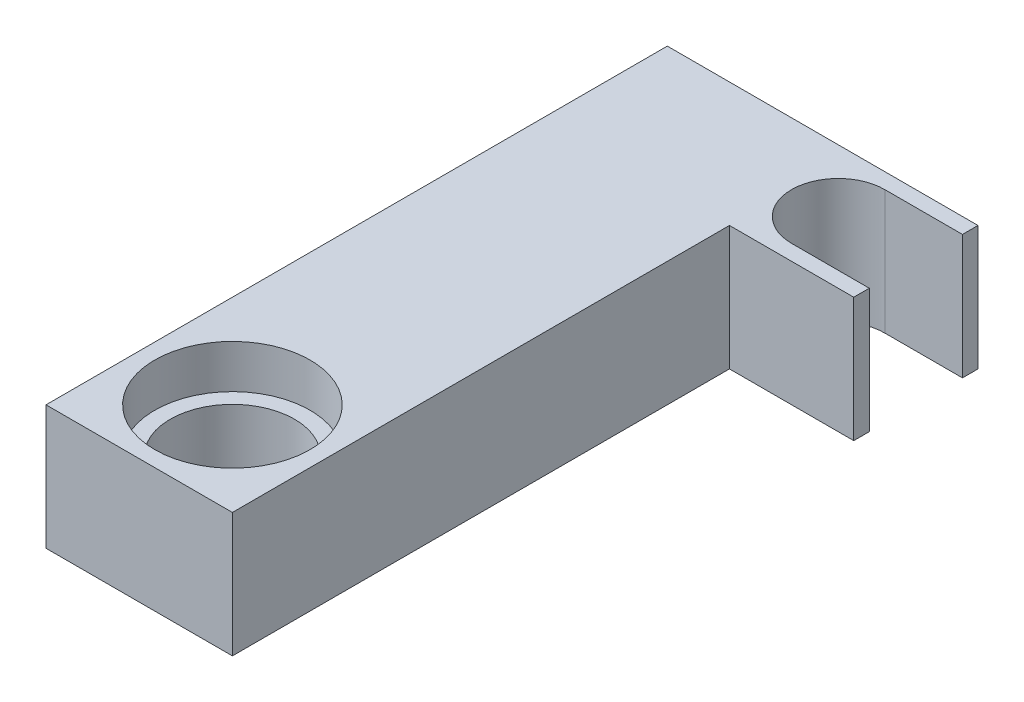
ISO-10303-21;
HEADER;
FILE_DESCRIPTION(('STEP AP214'),'2;1');
FILE_NAME('part.step','',(''),(''),'','','');
FILE_SCHEMA(('AUTOMOTIVE_DESIGN { 1 0 10303 214 1 1 1 1 }'));
ENDSEC;
DATA;
#1=APPLICATION_CONTEXT('core data for automotive mechanical design processes');
#2=APPLICATION_PROTOCOL_DEFINITION('international standard','automotive_design',2000,#1);
#3=PRODUCT_CONTEXT('',#1,'mechanical');
#4=PRODUCT('Part','Part','',(#3));
#5=PRODUCT_RELATED_PRODUCT_CATEGORY('part','',(#4));
#6=PRODUCT_DEFINITION_FORMATION('','',#4);
#7=PRODUCT_DEFINITION_CONTEXT('part definition',#1,'design');
#8=PRODUCT_DEFINITION('design','',#6,#7);
#9=PRODUCT_DEFINITION_SHAPE('','',#8);
#10=(LENGTH_UNIT() NAMED_UNIT(*) SI_UNIT(.MILLI.,.METRE.));
#11=(NAMED_UNIT(*) PLANE_ANGLE_UNIT() SI_UNIT($,.RADIAN.));
#12=(NAMED_UNIT(*) SI_UNIT($,.STERADIAN.) SOLID_ANGLE_UNIT());
#13=UNCERTAINTY_MEASURE_WITH_UNIT(LENGTH_MEASURE(1.E-05),#10,'distance_accuracy_value','');
#14=(GEOMETRIC_REPRESENTATION_CONTEXT(3) GLOBAL_UNCERTAINTY_ASSIGNED_CONTEXT((#13)) GLOBAL_UNIT_ASSIGNED_CONTEXT((#10,
#11,#12)) REPRESENTATION_CONTEXT('',''));
#15=CARTESIAN_POINT('',(0.,0.,0.));
#16=DIRECTION('',(0.,0.,1.));
#17=DIRECTION('',(1.,0.,0.));
#18=AXIS2_PLACEMENT_3D('',#15,#16,#17);
#19=CARTESIAN_POINT('',(37.5,20.,-90.));
#20=DIRECTION('',(0.,-1.,0.));
#21=DIRECTION('',(0.,0.,-1.));
#22=AXIS2_PLACEMENT_3D('',#19,#20,#21);
#23=CYLINDRICAL_SURFACE('',#22,7.50000000000001);
#24=CARTESIAN_POINT('',(37.5,0.,-90.));
#25=DIRECTION('',(0.,1.,0.));
#26=DIRECTION('',(0.,0.,1.));
#27=AXIS2_PLACEMENT_3D('',#24,#25,#26);
#28=CIRCLE('',#27,7.50000000000001);
#29=CARTESIAN_POINT('',(37.5,0.,-97.5));
#30=VERTEX_POINT('',#29);
#31=CARTESIAN_POINT('',(37.5,0.,-82.5));
#32=VERTEX_POINT('',#31);
#33=EDGE_CURVE('E144',#30,#32,#28,.T.);
#34=ORIENTED_EDGE('',*,*,#33,.F.);
#35=DIRECTION('',(0.,-1.,0.));
#36=VECTOR('',#35,1.);
#37=CARTESIAN_POINT('',(37.5,20.,-97.5));
#38=LINE('',#37,#36);
#39=CARTESIAN_POINT('',(37.5,20.,-97.5));
#40=VERTEX_POINT('',#39);
#41=EDGE_CURVE('E44',#40,#30,#38,.T.);
#42=ORIENTED_EDGE('',*,*,#41,.F.);
#43=CARTESIAN_POINT('',(37.5,20.,-90.));
#44=DIRECTION('',(0.,1.,0.));
#45=DIRECTION('',(0.,0.,1.));
#46=AXIS2_PLACEMENT_3D('',#43,#44,#45);
#47=CIRCLE('',#46,7.50000000000001);
#48=CARTESIAN_POINT('',(37.5,20.,-82.5));
#49=VERTEX_POINT('',#48);
#50=EDGE_CURVE('E249',#40,#49,#47,.T.);
#51=ORIENTED_EDGE('',*,*,#50,.T.);
#52=DIRECTION('',(0.,-1.,0.));
#53=VECTOR('',#52,1.);
#54=CARTESIAN_POINT('',(37.5,20.,-82.5));
#55=LINE('',#54,#53);
#56=EDGE_CURVE('E52',#49,#32,#55,.T.);
#57=ORIENTED_EDGE('',*,*,#56,.T.);
#58=EDGE_LOOP('',(#34,#42,#51,#57));
#59=FACE_BOUND('',#58,.T.);
#60=ADVANCED_FACE('F35',(#59),#23,.F.);
#61=CARTESIAN_POINT('',(0.,20.,-97.5));
#62=DIRECTION('',(0.,0.,-1.));
#63=DIRECTION('',(-1.,0.,0.));
#64=AXIS2_PLACEMENT_3D('',#61,#62,#63);
#65=PLANE('',#64);
#66=DIRECTION('',(1.,0.,0.));
#67=VECTOR('',#66,1.);
#68=CARTESIAN_POINT('',(0.,0.,-97.5));
#69=LINE('',#68,#67);
#70=CARTESIAN_POINT('',(50.,0.,-97.5));
#71=VERTEX_POINT('',#70);
#72=EDGE_CURVE('E146',#30,#71,#69,.T.);
#73=ORIENTED_EDGE('',*,*,#72,.T.);
#74=DIRECTION('',(0.,-1.,0.));
#75=VECTOR('',#74,1.);
#76=CARTESIAN_POINT('',(50.,20.,-97.5));
#77=LINE('',#76,#75);
#78=CARTESIAN_POINT('',(50.,20.,-97.5));
#79=VERTEX_POINT('',#78);
#80=EDGE_CURVE('E183',#79,#71,#77,.T.);
#81=ORIENTED_EDGE('',*,*,#80,.F.);
#82=DIRECTION('',(1.,0.,0.));
#83=VECTOR('',#82,1.);
#84=CARTESIAN_POINT('',(0.,20.,-97.5));
#85=LINE('',#84,#83);
#86=EDGE_CURVE('E188',#40,#79,#85,.T.);
#87=ORIENTED_EDGE('',*,*,#86,.F.);
#88=ORIENTED_EDGE('',*,*,#41,.T.);
#89=EDGE_LOOP('',(#73,#81,#87,#88));
#90=FACE_BOUND('',#89,.T.);
#91=ADVANCED_FACE('F186',(#90),#65,.F.);
#92=CARTESIAN_POINT('',(50.,20.,0.));
#93=DIRECTION('',(1.,0.,0.));
#94=DIRECTION('',(0.,0.,-1.));
#95=AXIS2_PLACEMENT_3D('',#92,#93,#94);
#96=PLANE('',#95);
#97=DIRECTION('',(0.,0.,1.));
#98=VECTOR('',#97,1.);
#99=CARTESIAN_POINT('',(50.,0.,0.));
#100=LINE('',#99,#98);
#101=CARTESIAN_POINT('',(50.,0.,-100.));
#102=VERTEX_POINT('',#101);
#103=EDGE_CURVE('E150',#102,#71,#100,.T.);
#104=ORIENTED_EDGE('',*,*,#103,.F.);
#105=DIRECTION('',(0.,-1.,0.));
#106=VECTOR('',#105,1.);
#107=CARTESIAN_POINT('',(50.,20.,-100.));
#108=LINE('',#107,#106);
#109=CARTESIAN_POINT('',(50.,20.,-100.));
#110=VERTEX_POINT('',#109);
#111=EDGE_CURVE('E181',#110,#102,#108,.T.);
#112=ORIENTED_EDGE('',*,*,#111,.F.);
#113=DIRECTION('',(0.,0.,1.));
#114=VECTOR('',#113,1.);
#115=CARTESIAN_POINT('',(50.,20.,0.));
#116=LINE('',#115,#114);
#117=EDGE_CURVE('E257',#110,#79,#116,.T.);
#118=ORIENTED_EDGE('',*,*,#117,.T.);
#119=ORIENTED_EDGE('',*,*,#80,.T.);
#120=EDGE_LOOP('',(#104,#112,#118,#119));
#121=FACE_BOUND('',#120,.T.);
#122=ADVANCED_FACE('F197',(#121),#96,.T.);
#123=CARTESIAN_POINT('',(0.,20.,-100.));
#124=DIRECTION('',(0.,0.,-1.));
#125=DIRECTION('',(-1.,0.,0.));
#126=AXIS2_PLACEMENT_3D('',#123,#124,#125);
#127=PLANE('',#126);
#128=DIRECTION('',(1.,0.,0.));
#129=VECTOR('',#128,1.);
#130=CARTESIAN_POINT('',(0.,0.,-100.));
#131=LINE('',#130,#129);
#132=CARTESIAN_POINT('',(0.,0.,-100.));
#133=VERTEX_POINT('',#132);
#134=EDGE_CURVE('E153',#133,#102,#131,.T.);
#135=ORIENTED_EDGE('',*,*,#134,.F.);
#136=DIRECTION('',(0.,-1.,0.));
#137=VECTOR('',#136,1.);
#138=CARTESIAN_POINT('',(0.,20.,-100.));
#139=LINE('',#138,#137);
#140=CARTESIAN_POINT('',(0.,20.,-100.));
#141=VERTEX_POINT('',#140);
#142=EDGE_CURVE('E179',#141,#133,#139,.T.);
#143=ORIENTED_EDGE('',*,*,#142,.F.);
#144=DIRECTION('',(1.,0.,0.));
#145=VECTOR('',#144,1.);
#146=CARTESIAN_POINT('',(0.,20.,-100.));
#147=LINE('',#146,#145);
#148=EDGE_CURVE('E260',#141,#110,#147,.T.);
#149=ORIENTED_EDGE('',*,*,#148,.T.);
#150=ORIENTED_EDGE('',*,*,#111,.T.);
#151=EDGE_LOOP('',(#135,#143,#149,#150));
#152=FACE_BOUND('',#151,.T.);
#153=ADVANCED_FACE('F202',(#152),#127,.T.);
#154=CARTESIAN_POINT('',(0.,20.,0.));
#155=DIRECTION('',(-1.,0.,0.));
#156=DIRECTION('',(0.,0.,1.));
#157=AXIS2_PLACEMENT_3D('',#154,#155,#156);
#158=PLANE('',#157);
#159=DIRECTION('',(0.,0.,-1.));
#160=VECTOR('',#159,1.);
#161=CARTESIAN_POINT('',(0.,0.,0.));
#162=LINE('',#161,#160);
#163=CARTESIAN_POINT('',(0.,0.,0.));
#164=VERTEX_POINT('',#163);
#165=EDGE_CURVE('E156',#164,#133,#162,.T.);
#166=ORIENTED_EDGE('',*,*,#165,.F.);
#167=DIRECTION('',(0.,-1.,0.));
#168=VECTOR('',#167,1.);
#169=CARTESIAN_POINT('',(0.,20.,0.));
#170=LINE('',#169,#168);
#171=CARTESIAN_POINT('',(0.,20.,0.));
#172=VERTEX_POINT('',#171);
#173=EDGE_CURVE('E177',#172,#164,#170,.T.);
#174=ORIENTED_EDGE('',*,*,#173,.F.);
#175=DIRECTION('',(0.,0.,-1.));
#176=VECTOR('',#175,1.);
#177=CARTESIAN_POINT('',(0.,20.,0.));
#178=LINE('',#177,#176);
#179=EDGE_CURVE('E263',#172,#141,#178,.T.);
#180=ORIENTED_EDGE('',*,*,#179,.T.);
#181=ORIENTED_EDGE('',*,*,#142,.T.);
#182=EDGE_LOOP('',(#166,#174,#180,#181));
#183=FACE_BOUND('',#182,.T.);
#184=ADVANCED_FACE('F206',(#183),#158,.T.);
#185=CARTESIAN_POINT('',(0.,20.,0.));
#186=DIRECTION('',(0.,0.,-1.));
#187=DIRECTION('',(-1.,0.,0.));
#188=AXIS2_PLACEMENT_3D('',#185,#186,#187);
#189=PLANE('',#188);
#190=DIRECTION('',(1.,0.,0.));
#191=VECTOR('',#190,1.);
#192=CARTESIAN_POINT('',(0.,0.,0.));
#193=LINE('',#192,#191);
#194=CARTESIAN_POINT('',(30.,0.,0.));
#195=VERTEX_POINT('',#194);
#196=EDGE_CURVE('E159',#164,#195,#193,.T.);
#197=ORIENTED_EDGE('',*,*,#196,.T.);
#198=DIRECTION('',(0.,-1.,0.));
#199=VECTOR('',#198,1.);
#200=CARTESIAN_POINT('',(30.,20.,0.));
#201=LINE('',#200,#199);
#202=CARTESIAN_POINT('',(30.,20.,0.));
#203=VERTEX_POINT('',#202);
#204=EDGE_CURVE('E175',#203,#195,#201,.T.);
#205=ORIENTED_EDGE('',*,*,#204,.F.);
#206=DIRECTION('',(1.,0.,0.));
#207=VECTOR('',#206,1.);
#208=CARTESIAN_POINT('',(0.,20.,0.));
#209=LINE('',#208,#207);
#210=EDGE_CURVE('E139',#172,#203,#209,.T.);
#211=ORIENTED_EDGE('',*,*,#210,.F.);
#212=ORIENTED_EDGE('',*,*,#173,.T.);
#213=EDGE_LOOP('',(#197,#205,#211,#212));
#214=FACE_BOUND('',#213,.T.);
#215=ADVANCED_FACE('F210',(#214),#189,.F.);
#216=CARTESIAN_POINT('',(30.,20.,0.));
#217=DIRECTION('',(1.,0.,0.));
#218=DIRECTION('',(0.,0.,-1.));
#219=AXIS2_PLACEMENT_3D('',#216,#217,#218);
#220=PLANE('',#219);
#221=DIRECTION('',(0.,0.,1.));
#222=VECTOR('',#221,1.);
#223=CARTESIAN_POINT('',(30.,0.,0.));
#224=LINE('',#223,#222);
#225=CARTESIAN_POINT('',(30.,0.,-80.));
#226=VERTEX_POINT('',#225);
#227=EDGE_CURVE('E162',#226,#195,#224,.T.);
#228=ORIENTED_EDGE('',*,*,#227,.F.);
#229=DIRECTION('',(0.,-1.,0.));
#230=VECTOR('',#229,1.);
#231=CARTESIAN_POINT('',(30.,20.,-80.));
#232=LINE('',#231,#230);
#233=CARTESIAN_POINT('',(30.,20.,-80.));
#234=VERTEX_POINT('',#233);
#235=EDGE_CURVE('E125',#234,#226,#232,.T.);
#236=ORIENTED_EDGE('',*,*,#235,.F.);
#237=DIRECTION('',(0.,0.,1.));
#238=VECTOR('',#237,1.);
#239=CARTESIAN_POINT('',(30.,20.,0.));
#240=LINE('',#239,#238);
#241=EDGE_CURVE('E137',#234,#203,#240,.T.);
#242=ORIENTED_EDGE('',*,*,#241,.T.);
#243=ORIENTED_EDGE('',*,*,#204,.T.);
#244=EDGE_LOOP('',(#228,#236,#242,#243));
#245=FACE_BOUND('',#244,.T.);
#246=ADVANCED_FACE('F214',(#245),#220,.T.);
#247=CARTESIAN_POINT('',(0.,20.,-80.));
#248=DIRECTION('',(0.,0.,1.));
#249=DIRECTION('',(1.,0.,0.));
#250=AXIS2_PLACEMENT_3D('',#247,#248,#249);
#251=PLANE('',#250);
#252=DIRECTION('',(-1.,0.,0.));
#253=VECTOR('',#252,1.);
#254=CARTESIAN_POINT('',(0.,0.,-80.));
#255=LINE('',#254,#253);
#256=CARTESIAN_POINT('',(50.,0.,-80.));
#257=VERTEX_POINT('',#256);
#258=EDGE_CURVE('E122',#257,#226,#255,.T.);
#259=ORIENTED_EDGE('',*,*,#258,.F.);
#260=DIRECTION('',(0.,-1.,0.));
#261=VECTOR('',#260,1.);
#262=CARTESIAN_POINT('',(50.,20.,-80.));
#263=LINE('',#262,#261);
#264=CARTESIAN_POINT('',(50.,20.,-80.));
#265=VERTEX_POINT('',#264);
#266=EDGE_CURVE('E116',#265,#257,#263,.T.);
#267=ORIENTED_EDGE('',*,*,#266,.F.);
#268=DIRECTION('',(-1.,0.,0.));
#269=VECTOR('',#268,1.);
#270=CARTESIAN_POINT('',(0.,20.,-80.));
#271=LINE('',#270,#269);
#272=EDGE_CURVE('E120',#265,#234,#271,.T.);
#273=ORIENTED_EDGE('',*,*,#272,.T.);
#274=ORIENTED_EDGE('',*,*,#235,.T.);
#275=EDGE_LOOP('',(#259,#267,#273,#274));
#276=FACE_BOUND('',#275,.T.);
#277=ADVANCED_FACE('F118',(#276),#251,.T.);
#278=CARTESIAN_POINT('',(50.,20.,0.));
#279=DIRECTION('',(-1.,0.,0.));
#280=DIRECTION('',(0.,0.,1.));
#281=AXIS2_PLACEMENT_3D('',#278,#279,#280);
#282=PLANE('',#281);
#283=DIRECTION('',(0.,0.,-1.));
#284=VECTOR('',#283,1.);
#285=CARTESIAN_POINT('',(50.,0.,0.));
#286=LINE('',#285,#284);
#287=CARTESIAN_POINT('',(50.,0.,-82.5));
#288=VERTEX_POINT('',#287);
#289=EDGE_CURVE('E166',#257,#288,#286,.T.);
#290=ORIENTED_EDGE('',*,*,#289,.T.);
#291=DIRECTION('',(0.,-1.,0.));
#292=VECTOR('',#291,1.);
#293=CARTESIAN_POINT('',(50.,20.,-82.5));
#294=LINE('',#293,#292);
#295=CARTESIAN_POINT('',(50.,20.,-82.5));
#296=VERTEX_POINT('',#295);
#297=EDGE_CURVE('E85',#296,#288,#294,.T.);
#298=ORIENTED_EDGE('',*,*,#297,.F.);
#299=DIRECTION('',(0.,0.,-1.));
#300=VECTOR('',#299,1.);
#301=CARTESIAN_POINT('',(50.,20.,0.));
#302=LINE('',#301,#300);
#303=EDGE_CURVE('E127',#265,#296,#302,.T.);
#304=ORIENTED_EDGE('',*,*,#303,.F.);
#305=ORIENTED_EDGE('',*,*,#266,.T.);
#306=EDGE_LOOP('',(#290,#298,#304,#305));
#307=FACE_BOUND('',#306,.T.);
#308=ADVANCED_FACE('F128',(#307),#282,.F.);
#309=CARTESIAN_POINT('',(15.,20.,-15.));
#310=DIRECTION('',(0.,-1.,0.));
#311=DIRECTION('',(0.,0.,-1.));
#312=AXIS2_PLACEMENT_3D('',#309,#310,#311);
#313=CYLINDRICAL_SURFACE('',#312,12.5);
#314=CARTESIAN_POINT('',(15.,13.,-15.));
#315=DIRECTION('',(0.,1.,0.));
#316=DIRECTION('',(0.,0.,1.));
#317=AXIS2_PLACEMENT_3D('',#314,#315,#316);
#318=CIRCLE('',#317,12.5);
#319=CARTESIAN_POINT('',(15.,13.,-2.50000000000001));
#320=VERTEX_POINT('',#319);
#321=EDGE_CURVE('E11',#320,#320,#318,.T.);
#322=ORIENTED_EDGE('',*,*,#321,.F.);
#323=EDGE_LOOP('',(#322));
#324=FACE_BOUND('',#323,.T.);
#325=CARTESIAN_POINT('',(15.,20.,-15.));
#326=DIRECTION('',(0.,1.,0.));
#327=DIRECTION('',(0.,0.,1.));
#328=AXIS2_PLACEMENT_3D('',#325,#326,#327);
#329=CIRCLE('',#328,12.5);
#330=CARTESIAN_POINT('',(15.,20.,-2.50000000000001));
#331=VERTEX_POINT('',#330);
#332=EDGE_CURVE('E171',#331,#331,#329,.T.);
#333=ORIENTED_EDGE('',*,*,#332,.T.);
#334=EDGE_LOOP('',(#333));
#335=FACE_BOUND('',#334,.T.);
#336=ADVANCED_FACE('F37',(#324,#335),#313,.F.);
#337=CARTESIAN_POINT('',(0.,20.,-82.5));
#338=DIRECTION('',(0.,0.,-1.));
#339=DIRECTION('',(-1.,0.,0.));
#340=AXIS2_PLACEMENT_3D('',#337,#338,#339);
#341=PLANE('',#340);
#342=DIRECTION('',(1.,0.,0.));
#343=VECTOR('',#342,1.);
#344=CARTESIAN_POINT('',(0.,0.,-82.5));
#345=LINE('',#344,#343);
#346=EDGE_CURVE('E168',#32,#288,#345,.T.);
#347=ORIENTED_EDGE('',*,*,#346,.F.);
#348=ORIENTED_EDGE('',*,*,#56,.F.);
#349=DIRECTION('',(1.,0.,0.));
#350=VECTOR('',#349,1.);
#351=CARTESIAN_POINT('',(0.,20.,-82.5));
#352=LINE('',#351,#350);
#353=EDGE_CURVE('E131',#49,#296,#352,.T.);
#354=ORIENTED_EDGE('',*,*,#353,.T.);
#355=ORIENTED_EDGE('',*,*,#297,.T.);
#356=EDGE_LOOP('',(#347,#348,#354,#355));
#357=FACE_BOUND('',#356,.T.);
#358=ADVANCED_FACE('F223',(#357),#341,.T.);
#359=CARTESIAN_POINT('',(0.,20.,0.));
#360=DIRECTION('',(0.,1.,0.));
#361=DIRECTION('',(0.,0.,1.));
#362=AXIS2_PLACEMENT_3D('',#359,#360,#361);
#363=PLANE('',#362);
#364=ORIENTED_EDGE('',*,*,#332,.F.);
#365=EDGE_LOOP('',(#364));
#366=FACE_BOUND('',#365,.T.);
#367=ORIENTED_EDGE('',*,*,#50,.F.);
#368=ORIENTED_EDGE('',*,*,#86,.T.);
#369=ORIENTED_EDGE('',*,*,#117,.F.);
#370=ORIENTED_EDGE('',*,*,#148,.F.);
#371=ORIENTED_EDGE('',*,*,#179,.F.);
#372=ORIENTED_EDGE('',*,*,#210,.T.);
#373=ORIENTED_EDGE('',*,*,#241,.F.);
#374=ORIENTED_EDGE('',*,*,#272,.F.);
#375=ORIENTED_EDGE('',*,*,#303,.T.);
#376=ORIENTED_EDGE('',*,*,#353,.F.);
#377=EDGE_LOOP('',(#367,#368,#369,#370,#371,#372,#373,#374,#375,#376));
#378=FACE_BOUND('',#377,.T.);
#379=ADVANCED_FACE('F135',(#366,#378),#363,.T.);
#380=CARTESIAN_POINT('',(0.,0.,0.));
#381=DIRECTION('',(0.,1.,0.));
#382=DIRECTION('',(0.,0.,1.));
#383=AXIS2_PLACEMENT_3D('',#380,#381,#382);
#384=PLANE('',#383);
#385=ORIENTED_EDGE('',*,*,#33,.T.);
#386=ORIENTED_EDGE('',*,*,#346,.T.);
#387=ORIENTED_EDGE('',*,*,#289,.F.);
#388=ORIENTED_EDGE('',*,*,#258,.T.);
#389=ORIENTED_EDGE('',*,*,#227,.T.);
#390=ORIENTED_EDGE('',*,*,#196,.F.);
#391=ORIENTED_EDGE('',*,*,#165,.T.);
#392=ORIENTED_EDGE('',*,*,#134,.T.);
#393=ORIENTED_EDGE('',*,*,#103,.T.);
#394=ORIENTED_EDGE('',*,*,#72,.F.);
#395=EDGE_LOOP('',(#385,#386,#387,#388,#389,#390,#391,#392,#393,#394));
#396=FACE_BOUND('',#395,.T.);
#397=CARTESIAN_POINT('',(15.,0.,-15.));
#398=DIRECTION('',(0.,1.,0.));
#399=DIRECTION('',(0.,0.,1.));
#400=AXIS2_PLACEMENT_3D('',#397,#398,#399);
#401=CIRCLE('',#400,10.);
#402=CARTESIAN_POINT('',(15.,0.,-25.));
#403=VERTEX_POINT('',#402);
#404=EDGE_CURVE('E253',#403,#403,#401,.T.);
#405=ORIENTED_EDGE('',*,*,#404,.T.);
#406=EDGE_LOOP('',(#405));
#407=FACE_BOUND('',#406,.T.);
#408=ADVANCED_FACE('F190',(#396,#407),#384,.F.);
#409=CARTESIAN_POINT('',(15.,13.,-15.));
#410=DIRECTION('',(0.,-1.,0.));
#411=DIRECTION('',(0.,0.,-1.));
#412=AXIS2_PLACEMENT_3D('',#409,#410,#411);
#413=CYLINDRICAL_SURFACE('',#412,10.);
#414=CARTESIAN_POINT('',(15.,13.,-15.));
#415=DIRECTION('',(0.,1.,0.));
#416=DIRECTION('',(0.,0.,1.));
#417=AXIS2_PLACEMENT_3D('',#414,#415,#416);
#418=CIRCLE('',#417,10.);
#419=CARTESIAN_POINT('',(15.,13.,-25.));
#420=VERTEX_POINT('',#419);
#421=EDGE_CURVE('E147',#420,#420,#418,.T.);
#422=CARTESIAN_POINT('',(15.,13.,-25.));
#423=CARTESIAN_POINT('',(15.,12.8645833333333,-25.));
#424=CARTESIAN_POINT('',(15.,12.7291666666667,-25.));
#425=CARTESIAN_POINT('',(15.,12.4583333333333,-25.));
#426=CARTESIAN_POINT('',(15.,12.3229166666667,-25.));
#427=CARTESIAN_POINT('',(15.,12.0520833333333,-25.));
#428=CARTESIAN_POINT('',(15.,11.9166666666667,-25.));
#429=CARTESIAN_POINT('',(15.,11.6458333333333,-25.));
#430=CARTESIAN_POINT('',(15.,11.5104166666667,-25.));
#431=CARTESIAN_POINT('',(15.,11.2395833333333,-25.));
#432=CARTESIAN_POINT('',(15.,11.1041666666667,-25.));
#433=CARTESIAN_POINT('',(15.,10.8333333333333,-25.));
#434=CARTESIAN_POINT('',(15.,10.6979166666667,-25.));
#435=CARTESIAN_POINT('',(15.,10.4270833333333,-25.));
#436=CARTESIAN_POINT('',(15.,10.2916666666667,-25.));
#437=CARTESIAN_POINT('',(15.,10.0208333333333,-25.));
#438=CARTESIAN_POINT('',(15.,9.88541666666667,-25.));
#439=CARTESIAN_POINT('',(15.,9.61458333333333,-25.));
#440=CARTESIAN_POINT('',(15.,9.47916666666667,-25.));
#441=CARTESIAN_POINT('',(15.,9.20833333333333,-25.));
#442=CARTESIAN_POINT('',(15.,9.07291666666666,-25.));
#443=CARTESIAN_POINT('',(15.,8.80208333333333,-25.));
#444=CARTESIAN_POINT('',(15.,8.66666666666667,-25.));
#445=CARTESIAN_POINT('',(15.,8.39583333333333,-25.));
#446=CARTESIAN_POINT('',(15.,8.26041666666667,-25.));
#447=CARTESIAN_POINT('',(15.,7.98958333333333,-25.));
#448=CARTESIAN_POINT('',(15.,7.85416666666667,-25.));
#449=CARTESIAN_POINT('',(15.,7.58333333333333,-25.));
#450=CARTESIAN_POINT('',(15.,7.44791666666667,-25.));
#451=CARTESIAN_POINT('',(15.,7.17708333333333,-25.));
#452=CARTESIAN_POINT('',(15.,7.04166666666667,-25.));
#453=CARTESIAN_POINT('',(15.,6.77083333333333,-25.));
#454=CARTESIAN_POINT('',(15.,6.63541666666667,-25.));
#455=CARTESIAN_POINT('',(15.,6.36458333333333,-25.));
#456=CARTESIAN_POINT('',(15.,6.22916666666667,-25.));
#457=CARTESIAN_POINT('',(15.,5.95833333333333,-25.));
#458=CARTESIAN_POINT('',(15.,5.82291666666667,-25.));
#459=CARTESIAN_POINT('',(15.,5.55208333333333,-25.));
#460=CARTESIAN_POINT('',(15.,5.41666666666667,-25.));
#461=CARTESIAN_POINT('',(15.,5.14583333333333,-25.));
#462=CARTESIAN_POINT('',(15.,5.01041666666667,-25.));
#463=CARTESIAN_POINT('',(15.,4.73958333333333,-25.));
#464=CARTESIAN_POINT('',(15.,4.60416666666667,-25.));
#465=CARTESIAN_POINT('',(15.,4.33333333333333,-25.));
#466=CARTESIAN_POINT('',(15.,4.19791666666667,-25.));
#467=CARTESIAN_POINT('',(15.,3.92708333333333,-25.));
#468=CARTESIAN_POINT('',(15.,3.79166666666667,-25.));
#469=CARTESIAN_POINT('',(15.,3.52083333333333,-25.));
#470=CARTESIAN_POINT('',(15.,3.38541666666667,-25.));
#471=CARTESIAN_POINT('',(15.,3.11458333333333,-25.));
#472=CARTESIAN_POINT('',(15.,2.97916666666667,-25.));
#473=CARTESIAN_POINT('',(15.,2.70833333333333,-25.));
#474=CARTESIAN_POINT('',(15.,2.57291666666667,-25.));
#475=CARTESIAN_POINT('',(15.,2.30208333333333,-25.));
#476=CARTESIAN_POINT('',(15.,2.16666666666667,-25.));
#477=CARTESIAN_POINT('',(15.,1.89583333333333,-25.));
#478=CARTESIAN_POINT('',(15.,1.76041666666667,-25.));
#479=CARTESIAN_POINT('',(15.,1.48958333333333,-25.));
#480=CARTESIAN_POINT('',(15.,1.35416666666667,-25.));
#481=CARTESIAN_POINT('',(15.,1.08333333333333,-25.));
#482=CARTESIAN_POINT('',(15.,0.947916666666667,-25.));
#483=CARTESIAN_POINT('',(15.,0.677083333333334,-25.));
#484=CARTESIAN_POINT('',(15.,0.541666666666667,-25.));
#485=CARTESIAN_POINT('',(15.,0.270833333333334,-25.));
#486=CARTESIAN_POINT('',(15.,0.135416666666667,-25.));
#487=CARTESIAN_POINT('',(15.,0.,-25.));
#488=B_SPLINE_CURVE_WITH_KNOTS('',3,(#422,#423,#424,#425,#426,#427,#428,#429,#430,#431,#432,
#433,#434,#435,#436,#437,#438,#439,#440,#441,#442,#443,#444,#445,#446,#447,#448,#449,#450,#451,
#452,#453,#454,#455,#456,#457,#458,#459,#460,#461,#462,#463,#464,#465,#466,#467,#468,#469,#470,
#471,#472,#473,#474,#475,#476,#477,#478,#479,#480,#481,#482,#483,#484,#485,#486,#487),
.UNSPECIFIED.,.F.,.F.,(4,2,2,2,2,2,2,2,2,2,2,2,2,2,2,2,2,2,2,2,2,2,2,2,2,2,2,2,2,2,2,2,4),(0.,
0.40625,0.812500000000001,1.21875,1.625,2.03125,2.4375,2.84375,3.25,3.65625,4.0625,4.46875,
4.875,5.28125,5.6875,6.09375,6.5,6.90625,7.3125,7.71875,8.125,8.53125,8.9375,9.34375,9.75,
10.15625,10.5625,10.96875,11.375,11.78125,12.1875,12.59375,13.),.UNSPECIFIED.);
#489=EDGE_CURVE('BSEAM228',#420,#403,#488,.T.);
#490=ORIENTED_EDGE('',*,*,#421,.T.);
#491=ORIENTED_EDGE('',*,*,#404,.F.);
#492=ORIENTED_EDGE('',*,*,#489,.T.);
#493=ORIENTED_EDGE('',*,*,#489,.F.);
#494=EDGE_LOOP('',(#490,#492,#491,#493));
#495=FACE_BOUND('',#494,.T.);
#496=ADVANCED_FACE('F228',(#495),#413,.F.);
#497=CARTESIAN_POINT('',(0.,13.,0.));
#498=DIRECTION('',(0.,1.,0.));
#499=DIRECTION('',(0.,0.,1.));
#500=AXIS2_PLACEMENT_3D('',#497,#498,#499);
#501=PLANE('',#500);
#502=ORIENTED_EDGE('',*,*,#421,.F.);
#503=EDGE_LOOP('',(#502));
#504=FACE_BOUND('',#503,.T.);
#505=ORIENTED_EDGE('',*,*,#321,.T.);
#506=EDGE_LOOP('',(#505));
#507=FACE_BOUND('',#506,.T.);
#508=ADVANCED_FACE('F234',(#504,#507),#501,.T.);
#509=CLOSED_SHELL('',(#60,#91,#122,#153,#184,#215,#246,#277,#308,#336,#358,#379,#408,#496,#508));
#510=MANIFOLD_SOLID_BREP('B2',#509);
#511=ADVANCED_BREP_SHAPE_REPRESENTATION('',(#18,#510),#14);
#512=SHAPE_DEFINITION_REPRESENTATION(#9,#511);
ENDSEC;
END-ISO-10303-21;
